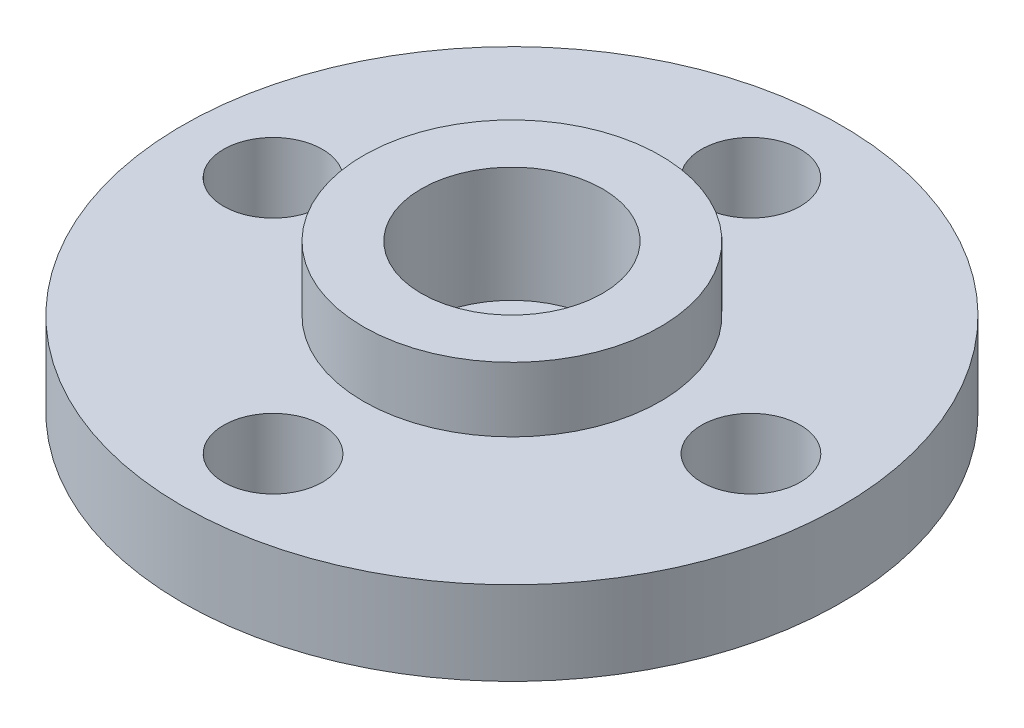
ISO-10303-21;
HEADER;
FILE_DESCRIPTION(('STEP AP214'),'2;1');
FILE_NAME('part.step','',(''),(''),'','','');
FILE_SCHEMA(('AUTOMOTIVE_DESIGN { 1 0 10303 214 1 1 1 1 }'));
ENDSEC;
DATA;
#1=APPLICATION_CONTEXT('core data for automotive mechanical design processes');
#2=APPLICATION_PROTOCOL_DEFINITION('international standard','automotive_design',2000,#1);
#3=PRODUCT_CONTEXT('',#1,'mechanical');
#4=PRODUCT('Part','Part','',(#3));
#5=PRODUCT_RELATED_PRODUCT_CATEGORY('part','',(#4));
#6=PRODUCT_DEFINITION_FORMATION('','',#4);
#7=PRODUCT_DEFINITION_CONTEXT('part definition',#1,'design');
#8=PRODUCT_DEFINITION('design','',#6,#7);
#9=PRODUCT_DEFINITION_SHAPE('','',#8);
#10=(LENGTH_UNIT() NAMED_UNIT(*) SI_UNIT(.MILLI.,.METRE.));
#11=(NAMED_UNIT(*) PLANE_ANGLE_UNIT() SI_UNIT($,.RADIAN.));
#12=(NAMED_UNIT(*) SI_UNIT($,.STERADIAN.) SOLID_ANGLE_UNIT());
#13=UNCERTAINTY_MEASURE_WITH_UNIT(LENGTH_MEASURE(1.E-05),#10,'distance_accuracy_value','');
#14=(GEOMETRIC_REPRESENTATION_CONTEXT(3) GLOBAL_UNCERTAINTY_ASSIGNED_CONTEXT((#13)) GLOBAL_UNIT_ASSIGNED_CONTEXT((#10,
#11,#12)) REPRESENTATION_CONTEXT('',''));
#15=CARTESIAN_POINT('',(0.,0.,0.));
#16=DIRECTION('',(0.,0.,1.));
#17=DIRECTION('',(1.,0.,0.));
#18=AXIS2_PLACEMENT_3D('',#15,#16,#17);
#19=CARTESIAN_POINT('',(0.,4.5,0.));
#20=DIRECTION('',(0.,-1.,0.));
#21=DIRECTION('',(0.,0.,-1.));
#22=AXIS2_PLACEMENT_3D('',#19,#20,#21);
#23=CYLINDRICAL_SURFACE('',#22,2.75);
#24=CARTESIAN_POINT('',(0.,4.5,0.));
#25=DIRECTION('',(0.,1.,0.));
#26=DIRECTION('',(0.,0.,1.));
#27=AXIS2_PLACEMENT_3D('',#24,#25,#26);
#28=CIRCLE('',#27,2.75);
#29=CARTESIAN_POINT('',(0.,4.5,2.75));
#30=VERTEX_POINT('',#29);
#31=EDGE_CURVE('E50',#30,#30,#28,.T.);
#32=ORIENTED_EDGE('',*,*,#31,.T.);
#33=EDGE_LOOP('',(#32));
#34=FACE_BOUND('',#33,.T.);
#35=CARTESIAN_POINT('',(0.,1.,0.));
#36=DIRECTION('',(0.,-1.,0.));
#37=DIRECTION('',(0.,0.,-1.));
#38=AXIS2_PLACEMENT_3D('',#35,#36,#37);
#39=CIRCLE('',#38,2.75);
#40=CARTESIAN_POINT('',(0.,1.,-2.75));
#41=VERTEX_POINT('',#40);
#42=EDGE_CURVE('E61',#41,#41,#39,.T.);
#43=ORIENTED_EDGE('',*,*,#42,.T.);
#44=EDGE_LOOP('',(#43));
#45=FACE_BOUND('',#44,.T.);
#46=ADVANCED_FACE('F32',(#34,#45),#23,.F.);
#47=CARTESIAN_POINT('',(0.,2.54,0.));
#48=DIRECTION('',(0.,1.,0.));
#49=DIRECTION('',(0.,0.,1.));
#50=AXIS2_PLACEMENT_3D('',#47,#48,#49);
#51=PLANE('',#50);
#52=CARTESIAN_POINT('',(-7.2489999999999,2.54,0.00100000000002567));
#53=DIRECTION('',(0.,1.,0.));
#54=DIRECTION('',(0.,0.,1.));
#55=AXIS2_PLACEMENT_3D('',#52,#53,#54);
#56=CIRCLE('',#55,1.5);
#57=CARTESIAN_POINT('',(-7.2489999999999,2.54,1.50100000000003));
#58=VERTEX_POINT('',#57);
#59=EDGE_CURVE('E53',#58,#58,#56,.T.);
#60=ORIENTED_EDGE('',*,*,#59,.F.);
#61=EDGE_LOOP('',(#60));
#62=FACE_BOUND('',#61,.T.);
#63=CARTESIAN_POINT('',(0.,2.54,-7.25));
#64=DIRECTION('',(0.,1.,0.));
#65=DIRECTION('',(0.,0.,1.));
#66=AXIS2_PLACEMENT_3D('',#63,#64,#65);
#67=CIRCLE('',#66,1.5);
#68=CARTESIAN_POINT('',(0.,2.54,-5.75));
#69=VERTEX_POINT('',#68);
#70=EDGE_CURVE('E68',#69,#69,#67,.T.);
#71=ORIENTED_EDGE('',*,*,#70,.F.);
#72=EDGE_LOOP('',(#71));
#73=FACE_BOUND('',#72,.T.);
#74=CARTESIAN_POINT('',(7.2510000000001,2.54,-0.0010000000000763));
#75=DIRECTION('',(0.,1.,0.));
#76=DIRECTION('',(0.,0.,1.));
#77=AXIS2_PLACEMENT_3D('',#74,#75,#76);
#78=CIRCLE('',#77,1.5);
#79=CARTESIAN_POINT('',(7.2510000000001,2.54,1.49899999999992));
#80=VERTEX_POINT('',#79);
#81=EDGE_CURVE('E62',#80,#80,#78,.T.);
#82=ORIENTED_EDGE('',*,*,#81,.F.);
#83=EDGE_LOOP('',(#82));
#84=FACE_BOUND('',#83,.T.);
#85=CARTESIAN_POINT('',(0.00200000000015267,2.54,7.25));
#86=DIRECTION('',(0.,1.,0.));
#87=DIRECTION('',(0.,0.,1.));
#88=AXIS2_PLACEMENT_3D('',#85,#86,#87);
#89=CIRCLE('',#88,1.5);
#90=CARTESIAN_POINT('',(0.00200000000015267,2.54,8.75));
#91=VERTEX_POINT('',#90);
#92=EDGE_CURVE('E54',#91,#91,#89,.T.);
#93=ORIENTED_EDGE('',*,*,#92,.F.);
#94=EDGE_LOOP('',(#93));
#95=FACE_BOUND('',#94,.T.);
#96=CARTESIAN_POINT('',(0.,2.54,0.));
#97=DIRECTION('',(0.,1.,0.));
#98=DIRECTION('',(0.,0.,1.));
#99=AXIS2_PLACEMENT_3D('',#96,#97,#98);
#100=CIRCLE('',#99,10.);
#101=CARTESIAN_POINT('',(0.,2.54,10.));
#102=VERTEX_POINT('',#101);
#103=EDGE_CURVE('E10',#102,#102,#100,.T.);
#104=ORIENTED_EDGE('',*,*,#103,.T.);
#105=EDGE_LOOP('',(#104));
#106=FACE_BOUND('',#105,.T.);
#107=CARTESIAN_POINT('',(0.,2.54,0.));
#108=DIRECTION('',(0.,1.,0.));
#109=DIRECTION('',(0.,0.,1.));
#110=AXIS2_PLACEMENT_3D('',#107,#108,#109);
#111=CIRCLE('',#110,4.505);
#112=CARTESIAN_POINT('',(0.,2.54,4.505));
#113=VERTEX_POINT('',#112);
#114=EDGE_CURVE('E43',#113,#113,#111,.T.);
#115=ORIENTED_EDGE('',*,*,#114,.F.);
#116=EDGE_LOOP('',(#115));
#117=FACE_BOUND('',#116,.T.);
#118=ADVANCED_FACE('F98',(#62,#73,#84,#95,#106,#117),#51,.T.);
#119=CARTESIAN_POINT('',(0.,0.,0.));
#120=DIRECTION('',(0.,1.,0.));
#121=DIRECTION('',(0.,0.,1.));
#122=AXIS2_PLACEMENT_3D('',#119,#120,#121);
#123=PLANE('',#122);
#124=CARTESIAN_POINT('',(-7.2489999999999,0.,0.00100000000002567));
#125=DIRECTION('',(0.,1.,0.));
#126=DIRECTION('',(0.,0.,1.));
#127=AXIS2_PLACEMENT_3D('',#124,#125,#126);
#128=CIRCLE('',#127,1.5);
#129=CARTESIAN_POINT('',(-7.2489999999999,0.,1.50100000000003));
#130=VERTEX_POINT('',#129);
#131=EDGE_CURVE('E71',#130,#130,#128,.T.);
#132=ORIENTED_EDGE('',*,*,#131,.T.);
#133=EDGE_LOOP('',(#132));
#134=FACE_BOUND('',#133,.T.);
#135=CARTESIAN_POINT('',(0.,0.,-7.25));
#136=DIRECTION('',(0.,1.,0.));
#137=DIRECTION('',(0.,0.,1.));
#138=AXIS2_PLACEMENT_3D('',#135,#136,#137);
#139=CIRCLE('',#138,1.5);
#140=CARTESIAN_POINT('',(0.,0.,-5.75));
#141=VERTEX_POINT('',#140);
#142=EDGE_CURVE('E65',#141,#141,#139,.T.);
#143=ORIENTED_EDGE('',*,*,#142,.T.);
#144=EDGE_LOOP('',(#143));
#145=FACE_BOUND('',#144,.T.);
#146=CARTESIAN_POINT('',(7.2510000000001,0.,-0.0010000000000763));
#147=DIRECTION('',(0.,1.,0.));
#148=DIRECTION('',(0.,0.,1.));
#149=AXIS2_PLACEMENT_3D('',#146,#147,#148);
#150=CIRCLE('',#149,1.5);
#151=CARTESIAN_POINT('',(7.2510000000001,0.,1.49899999999992));
#152=VERTEX_POINT('',#151);
#153=EDGE_CURVE('E57',#152,#152,#150,.T.);
#154=ORIENTED_EDGE('',*,*,#153,.T.);
#155=EDGE_LOOP('',(#154));
#156=FACE_BOUND('',#155,.T.);
#157=CARTESIAN_POINT('',(0.00200000000015267,0.,7.25));
#158=DIRECTION('',(0.,1.,0.));
#159=DIRECTION('',(0.,0.,1.));
#160=AXIS2_PLACEMENT_3D('',#157,#158,#159);
#161=CIRCLE('',#160,1.5);
#162=CARTESIAN_POINT('',(0.00200000000015267,0.,8.75));
#163=VERTEX_POINT('',#162);
#164=EDGE_CURVE('E58',#163,#163,#161,.T.);
#165=ORIENTED_EDGE('',*,*,#164,.T.);
#166=EDGE_LOOP('',(#165));
#167=FACE_BOUND('',#166,.T.);
#168=CARTESIAN_POINT('',(0.,0.,0.));
#169=DIRECTION('',(0.,1.,0.));
#170=DIRECTION('',(0.,0.,1.));
#171=AXIS2_PLACEMENT_3D('',#168,#169,#170);
#172=CIRCLE('',#171,10.);
#173=CARTESIAN_POINT('',(0.,0.,10.));
#174=VERTEX_POINT('',#173);
#175=EDGE_CURVE('E36',#174,#174,#172,.T.);
#176=ORIENTED_EDGE('',*,*,#175,.F.);
#177=EDGE_LOOP('',(#176));
#178=FACE_BOUND('',#177,.T.);
#179=CARTESIAN_POINT('',(0.,0.,0.));
#180=DIRECTION('',(0.,-1.,0.));
#181=DIRECTION('',(0.,0.,-1.));
#182=AXIS2_PLACEMENT_3D('',#179,#180,#181);
#183=CIRCLE('',#182,1.5);
#184=CARTESIAN_POINT('',(0.,0.,-1.5));
#185=VERTEX_POINT('',#184);
#186=EDGE_CURVE('E81',#185,#185,#183,.T.);
#187=ORIENTED_EDGE('',*,*,#186,.F.);
#188=EDGE_LOOP('',(#187));
#189=FACE_BOUND('',#188,.T.);
#190=ADVANCED_FACE('F96',(#134,#145,#156,#167,#178,#189),#123,.F.);
#191=CARTESIAN_POINT('',(0.,2.54,0.));
#192=DIRECTION('',(0.,-1.,0.));
#193=DIRECTION('',(0.,0.,-1.));
#194=AXIS2_PLACEMENT_3D('',#191,#192,#193);
#195=CYLINDRICAL_SURFACE('',#194,10.);
#196=ORIENTED_EDGE('',*,*,#103,.F.);
#197=EDGE_LOOP('',(#196));
#198=FACE_BOUND('',#197,.T.);
#199=ORIENTED_EDGE('',*,*,#175,.T.);
#200=EDGE_LOOP('',(#199));
#201=FACE_BOUND('',#200,.T.);
#202=ADVANCED_FACE('F34',(#198,#201),#195,.T.);
#203=CARTESIAN_POINT('',(0.,4.5,0.));
#204=DIRECTION('',(0.,1.,0.));
#205=DIRECTION('',(0.,0.,1.));
#206=AXIS2_PLACEMENT_3D('',#203,#204,#205);
#207=PLANE('',#206);
#208=CARTESIAN_POINT('',(0.,4.5,0.));
#209=DIRECTION('',(0.,1.,0.));
#210=DIRECTION('',(0.,0.,1.));
#211=AXIS2_PLACEMENT_3D('',#208,#209,#210);
#212=CIRCLE('',#211,4.505);
#213=CARTESIAN_POINT('',(0.,4.5,4.505));
#214=VERTEX_POINT('',#213);
#215=EDGE_CURVE('E47',#214,#214,#212,.T.);
#216=ORIENTED_EDGE('',*,*,#215,.T.);
#217=EDGE_LOOP('',(#216));
#218=FACE_BOUND('',#217,.T.);
#219=ORIENTED_EDGE('',*,*,#31,.F.);
#220=EDGE_LOOP('',(#219));
#221=FACE_BOUND('',#220,.T.);
#222=ADVANCED_FACE('F105',(#218,#221),#207,.T.);
#223=CARTESIAN_POINT('',(0.,4.5,0.));
#224=DIRECTION('',(0.,-1.,0.));
#225=DIRECTION('',(0.,0.,-1.));
#226=AXIS2_PLACEMENT_3D('',#223,#224,#225);
#227=CYLINDRICAL_SURFACE('',#226,4.505);
#228=ORIENTED_EDGE('',*,*,#114,.T.);
#229=EDGE_LOOP('',(#228));
#230=FACE_BOUND('',#229,.T.);
#231=ORIENTED_EDGE('',*,*,#215,.F.);
#232=EDGE_LOOP('',(#231));
#233=FACE_BOUND('',#232,.T.);
#234=ADVANCED_FACE('F124',(#230,#233),#227,.T.);
#235=CARTESIAN_POINT('',(0.00200000000015267,6.78264068711929,7.25));
#236=DIRECTION('',(0.,-1.,0.));
#237=DIRECTION('',(0.,0.,-1.));
#238=AXIS2_PLACEMENT_3D('',#235,#236,#237);
#239=CYLINDRICAL_SURFACE('',#238,1.5);
#240=ORIENTED_EDGE('',*,*,#164,.F.);
#241=EDGE_LOOP('',(#240));
#242=FACE_BOUND('',#241,.T.);
#243=ORIENTED_EDGE('',*,*,#92,.T.);
#244=EDGE_LOOP('',(#243));
#245=FACE_BOUND('',#244,.T.);
#246=ADVANCED_FACE('F120',(#242,#245),#239,.F.);
#247=CARTESIAN_POINT('',(7.2510000000001,6.78264068711929,-0.0010000000000763));
#248=DIRECTION('',(0.,-1.,0.));
#249=DIRECTION('',(0.,0.,-1.));
#250=AXIS2_PLACEMENT_3D('',#247,#248,#249);
#251=CYLINDRICAL_SURFACE('',#250,1.5);
#252=ORIENTED_EDGE('',*,*,#153,.F.);
#253=EDGE_LOOP('',(#252));
#254=FACE_BOUND('',#253,.T.);
#255=ORIENTED_EDGE('',*,*,#81,.T.);
#256=EDGE_LOOP('',(#255));
#257=FACE_BOUND('',#256,.T.);
#258=ADVANCED_FACE('F131',(#254,#257),#251,.F.);
#259=CARTESIAN_POINT('',(0.,6.78264068711929,-7.25));
#260=DIRECTION('',(0.,-1.,0.));
#261=DIRECTION('',(0.,0.,-1.));
#262=AXIS2_PLACEMENT_3D('',#259,#260,#261);
#263=CYLINDRICAL_SURFACE('',#262,1.5);
#264=ORIENTED_EDGE('',*,*,#142,.F.);
#265=EDGE_LOOP('',(#264));
#266=FACE_BOUND('',#265,.T.);
#267=ORIENTED_EDGE('',*,*,#70,.T.);
#268=EDGE_LOOP('',(#267));
#269=FACE_BOUND('',#268,.T.);
#270=ADVANCED_FACE('F142',(#266,#269),#263,.F.);
#271=CARTESIAN_POINT('',(-7.2489999999999,6.78264068711929,0.00100000000002567));
#272=DIRECTION('',(0.,-1.,0.));
#273=DIRECTION('',(0.,0.,-1.));
#274=AXIS2_PLACEMENT_3D('',#271,#272,#273);
#275=CYLINDRICAL_SURFACE('',#274,1.5);
#276=ORIENTED_EDGE('',*,*,#131,.F.);
#277=EDGE_LOOP('',(#276));
#278=FACE_BOUND('',#277,.T.);
#279=ORIENTED_EDGE('',*,*,#59,.T.);
#280=EDGE_LOOP('',(#279));
#281=FACE_BOUND('',#280,.T.);
#282=ADVANCED_FACE('F155',(#278,#281),#275,.F.);
#283=CARTESIAN_POINT('',(0.,1.,0.));
#284=DIRECTION('',(0.,-1.,0.));
#285=DIRECTION('',(0.,0.,-1.));
#286=AXIS2_PLACEMENT_3D('',#283,#284,#285);
#287=PLANE('',#286);
#288=CARTESIAN_POINT('',(0.,1.,0.));
#289=DIRECTION('',(0.,-1.,0.));
#290=DIRECTION('',(0.,0.,-1.));
#291=AXIS2_PLACEMENT_3D('',#288,#289,#290);
#292=CIRCLE('',#291,1.5);
#293=CARTESIAN_POINT('',(0.,1.,-1.5));
#294=VERTEX_POINT('',#293);
#295=EDGE_CURVE('E80',#294,#294,#292,.T.);
#296=ORIENTED_EDGE('',*,*,#295,.T.);
#297=EDGE_LOOP('',(#296));
#298=FACE_BOUND('',#297,.T.);
#299=ORIENTED_EDGE('',*,*,#42,.F.);
#300=EDGE_LOOP('',(#299));
#301=FACE_BOUND('',#300,.T.);
#302=ADVANCED_FACE('F87',(#298,#301),#287,.F.);
#303=CARTESIAN_POINT('',(0.,1.,0.));
#304=DIRECTION('',(0.,-1.,0.));
#305=DIRECTION('',(0.,0.,-1.));
#306=AXIS2_PLACEMENT_3D('',#303,#304,#305);
#307=CYLINDRICAL_SURFACE('',#306,1.5);
#308=ORIENTED_EDGE('',*,*,#295,.F.);
#309=EDGE_LOOP('',(#308));
#310=FACE_BOUND('',#309,.T.);
#311=ORIENTED_EDGE('',*,*,#186,.T.);
#312=EDGE_LOOP('',(#311));
#313=FACE_BOUND('',#312,.T.);
#314=ADVANCED_FACE('F90',(#310,#313),#307,.F.);
#315=CLOSED_SHELL('',(#46,#118,#190,#202,#222,#234,#246,#258,#270,#282,#302,#314));
#316=MANIFOLD_SOLID_BREP('B2',#315);
#317=ADVANCED_BREP_SHAPE_REPRESENTATION('',(#18,#316),#14);
#318=SHAPE_DEFINITION_REPRESENTATION(#9,#317);
ENDSEC;
END-ISO-10303-21;
